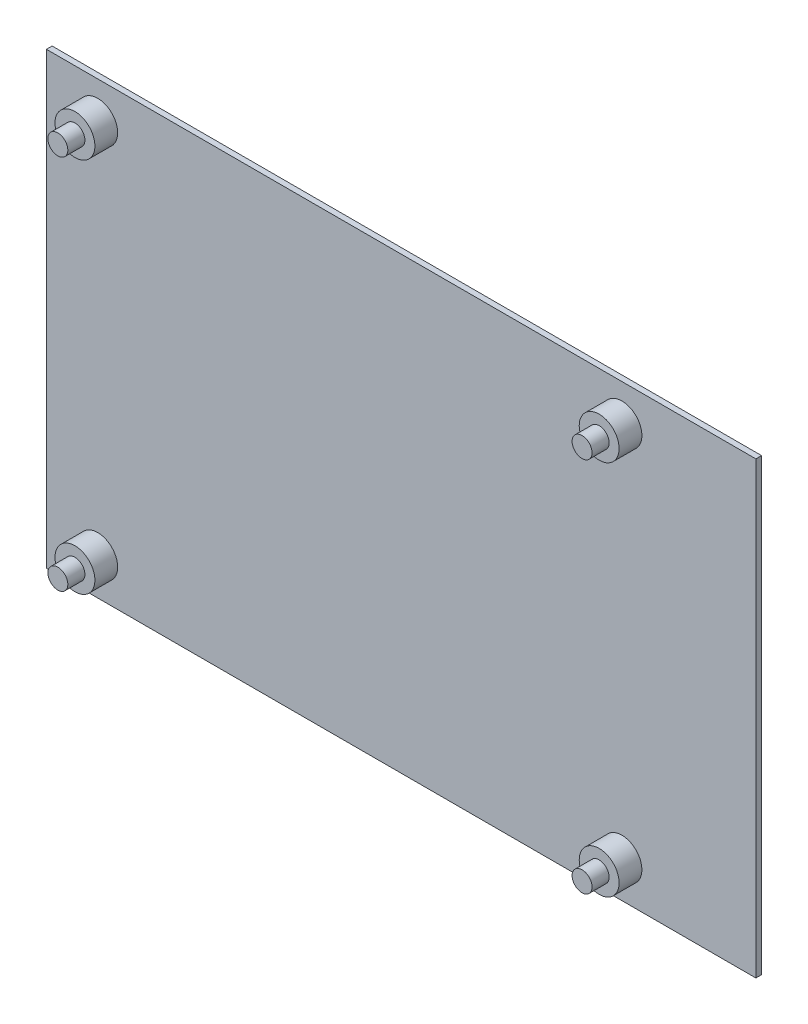
ISO-10303-21;
HEADER;
FILE_DESCRIPTION(('STEP AP214'),'2;1');
FILE_NAME('part.step','',(''),(''),'','','');
FILE_SCHEMA(('AUTOMOTIVE_DESIGN { 1 0 10303 214 1 1 1 1 }'));
ENDSEC;
DATA;
#1=APPLICATION_CONTEXT('core data for automotive mechanical design processes');
#2=APPLICATION_PROTOCOL_DEFINITION('international standard','automotive_design',2000,#1);
#3=PRODUCT_CONTEXT('',#1,'mechanical');
#4=PRODUCT('Part','Part','',(#3));
#5=PRODUCT_RELATED_PRODUCT_CATEGORY('part','',(#4));
#6=PRODUCT_DEFINITION_FORMATION('','',#4);
#7=PRODUCT_DEFINITION_CONTEXT('part definition',#1,'design');
#8=PRODUCT_DEFINITION('design','',#6,#7);
#9=PRODUCT_DEFINITION_SHAPE('','',#8);
#10=(LENGTH_UNIT() NAMED_UNIT(*) SI_UNIT(.MILLI.,.METRE.));
#11=(NAMED_UNIT(*) PLANE_ANGLE_UNIT() SI_UNIT($,.RADIAN.));
#12=(NAMED_UNIT(*) SI_UNIT($,.STERADIAN.) SOLID_ANGLE_UNIT());
#13=UNCERTAINTY_MEASURE_WITH_UNIT(LENGTH_MEASURE(1.E-05),#10,'distance_accuracy_value','');
#14=(GEOMETRIC_REPRESENTATION_CONTEXT(3) GLOBAL_UNCERTAINTY_ASSIGNED_CONTEXT((#13)) GLOBAL_UNIT_ASSIGNED_CONTEXT((#10,
#11,#12)) REPRESENTATION_CONTEXT('',''));
#15=CARTESIAN_POINT('',(0.,0.,0.));
#16=DIRECTION('',(0.,0.,1.));
#17=DIRECTION('',(1.,0.,0.));
#18=AXIS2_PLACEMENT_3D('',#15,#16,#17);
#19=CARTESIAN_POINT('',(-77.2499999999999,34.2,1.));
#20=DIRECTION('',(1.,0.,0.));
#21=DIRECTION('',(0.,0.,-1.));
#22=AXIS2_PLACEMENT_3D('',#19,#20,#21);
#23=PLANE('',#22);
#24=DIRECTION('',(0.,-1.,0.));
#25=VECTOR('',#24,1.);
#26=CARTESIAN_POINT('',(-77.2499999999999,34.2,0.));
#27=LINE('',#26,#25);
#28=CARTESIAN_POINT('',(-77.2499999999999,34.2,0.));
#29=VERTEX_POINT('',#28);
#30=CARTESIAN_POINT('',(-77.2499999999999,-44.7,0.));
#31=VERTEX_POINT('',#30);
#32=EDGE_CURVE('E99',#29,#31,#27,.T.);
#33=ORIENTED_EDGE('',*,*,#32,.T.);
#34=DIRECTION('',(0.,0.,-1.));
#35=VECTOR('',#34,1.);
#36=CARTESIAN_POINT('',(-77.2499999999999,-44.7,1.));
#37=LINE('',#36,#35);
#38=CARTESIAN_POINT('',(-77.2499999999999,-44.7,1.));
#39=VERTEX_POINT('',#38);
#40=EDGE_CURVE('E90',#39,#31,#37,.T.);
#41=ORIENTED_EDGE('',*,*,#40,.F.);
#42=DIRECTION('',(0.,-1.,0.));
#43=VECTOR('',#42,1.);
#44=CARTESIAN_POINT('',(-77.2499999999999,34.2,1.));
#45=LINE('',#44,#43);
#46=CARTESIAN_POINT('',(-77.2499999999999,34.2,1.));
#47=VERTEX_POINT('',#46);
#48=EDGE_CURVE('E84',#47,#39,#45,.T.);
#49=ORIENTED_EDGE('',*,*,#48,.F.);
#50=DIRECTION('',(0.,0.,-1.));
#51=VECTOR('',#50,1.);
#52=CARTESIAN_POINT('',(-77.2499999999999,34.2,1.));
#53=LINE('',#52,#51);
#54=EDGE_CURVE('E95',#47,#29,#53,.T.);
#55=ORIENTED_EDGE('',*,*,#54,.T.);
#56=EDGE_LOOP('',(#33,#41,#49,#55));
#57=FACE_BOUND('',#56,.T.);
#58=ADVANCED_FACE('F32',(#57),#23,.F.);
#59=CARTESIAN_POINT('',(47.25,-44.7,1.));
#60=DIRECTION('',(0.,1.,0.));
#61=DIRECTION('',(0.,0.,1.));
#62=AXIS2_PLACEMENT_3D('',#59,#60,#61);
#63=PLANE('',#62);
#64=DIRECTION('',(1.,0.,0.));
#65=VECTOR('',#64,1.);
#66=CARTESIAN_POINT('',(47.25,-44.7,0.));
#67=LINE('',#66,#65);
#68=CARTESIAN_POINT('',(47.25,-44.7,0.));
#69=VERTEX_POINT('',#68);
#70=EDGE_CURVE('E89',#31,#69,#67,.T.);
#71=ORIENTED_EDGE('',*,*,#70,.T.);
#72=DIRECTION('',(0.,0.,-1.));
#73=VECTOR('',#72,1.);
#74=CARTESIAN_POINT('',(47.25,-44.7,1.));
#75=LINE('',#74,#73);
#76=CARTESIAN_POINT('',(47.25,-44.7,1.));
#77=VERTEX_POINT('',#76);
#78=EDGE_CURVE('E87',#77,#69,#75,.T.);
#79=ORIENTED_EDGE('',*,*,#78,.F.);
#80=DIRECTION('',(1.,0.,0.));
#81=VECTOR('',#80,1.);
#82=CARTESIAN_POINT('',(47.25,-44.7,1.));
#83=LINE('',#82,#81);
#84=EDGE_CURVE('E79',#39,#77,#83,.T.);
#85=ORIENTED_EDGE('',*,*,#84,.F.);
#86=ORIENTED_EDGE('',*,*,#40,.T.);
#87=EDGE_LOOP('',(#71,#79,#85,#86));
#88=FACE_BOUND('',#87,.T.);
#89=ADVANCED_FACE('F88',(#88),#63,.F.);
#90=CARTESIAN_POINT('',(47.25,34.2,1.));
#91=DIRECTION('',(-1.,0.,0.));
#92=DIRECTION('',(0.,-1.,0.));
#93=AXIS2_PLACEMENT_3D('',#90,#91,#92);
#94=PLANE('',#93);
#95=DIRECTION('',(0.,1.,0.));
#96=VECTOR('',#95,1.);
#97=CARTESIAN_POINT('',(47.25,34.2,0.));
#98=LINE('',#97,#96);
#99=CARTESIAN_POINT('',(47.25,34.2,0.));
#100=VERTEX_POINT('',#99);
#101=EDGE_CURVE('E65',#69,#100,#98,.T.);
#102=ORIENTED_EDGE('',*,*,#101,.T.);
#103=DIRECTION('',(0.,0.,-1.));
#104=VECTOR('',#103,1.);
#105=CARTESIAN_POINT('',(47.25,34.2,1.));
#106=LINE('',#105,#104);
#107=CARTESIAN_POINT('',(47.25,34.2,1.));
#108=VERTEX_POINT('',#107);
#109=EDGE_CURVE('E91',#108,#100,#106,.T.);
#110=ORIENTED_EDGE('',*,*,#109,.F.);
#111=DIRECTION('',(0.,1.,0.));
#112=VECTOR('',#111,1.);
#113=CARTESIAN_POINT('',(47.25,34.2,1.));
#114=LINE('',#113,#112);
#115=EDGE_CURVE('E82',#77,#108,#114,.T.);
#116=ORIENTED_EDGE('',*,*,#115,.F.);
#117=ORIENTED_EDGE('',*,*,#78,.T.);
#118=EDGE_LOOP('',(#102,#110,#116,#117));
#119=FACE_BOUND('',#118,.T.);
#120=ADVANCED_FACE('F93',(#119),#94,.F.);
#121=CARTESIAN_POINT('',(47.25,34.2,1.));
#122=DIRECTION('',(0.,-1.,0.));
#123=DIRECTION('',(1.,0.,0.));
#124=AXIS2_PLACEMENT_3D('',#121,#122,#123);
#125=PLANE('',#124);
#126=DIRECTION('',(-1.,0.,0.));
#127=VECTOR('',#126,1.);
#128=CARTESIAN_POINT('',(47.25,34.2,0.));
#129=LINE('',#128,#127);
#130=EDGE_CURVE('E71',#100,#29,#129,.T.);
#131=ORIENTED_EDGE('',*,*,#130,.T.);
#132=ORIENTED_EDGE('',*,*,#54,.F.);
#133=DIRECTION('',(-1.,0.,0.));
#134=VECTOR('',#133,1.);
#135=CARTESIAN_POINT('',(47.25,34.2,1.));
#136=LINE('',#135,#134);
#137=EDGE_CURVE('E48',#108,#47,#136,.T.);
#138=ORIENTED_EDGE('',*,*,#137,.F.);
#139=ORIENTED_EDGE('',*,*,#109,.T.);
#140=EDGE_LOOP('',(#131,#132,#138,#139));
#141=FACE_BOUND('',#140,.T.);
#142=ADVANCED_FACE('F122',(#141),#125,.F.);
#143=CARTESIAN_POINT('',(0.,0.,1.));
#144=DIRECTION('',(0.,0.,-1.));
#145=DIRECTION('',(-1.,0.,0.));
#146=AXIS2_PLACEMENT_3D('',#143,#144,#145);
#147=PLANE('',#146);
#148=CARTESIAN_POINT('',(-68.2499999999999,-38.25,1.));
#149=DIRECTION('',(0.,0.,-1.));
#150=DIRECTION('',(-1.,0.,0.));
#151=AXIS2_PLACEMENT_3D('',#148,#149,#150);
#152=CIRCLE('',#151,3.50000000000001);
#153=CARTESIAN_POINT('',(-71.75,-38.25,1.));
#154=VERTEX_POINT('',#153);
#155=EDGE_CURVE('E11',#154,#154,#152,.F.);
#156=ORIENTED_EDGE('',*,*,#155,.F.);
#157=EDGE_LOOP('',(#156));
#158=FACE_BOUND('',#157,.T.);
#159=CARTESIAN_POINT('',(23.7500000000001,-38.25,1.));
#160=DIRECTION('',(0.,0.,-1.));
#161=DIRECTION('',(-1.,0.,0.));
#162=AXIS2_PLACEMENT_3D('',#159,#160,#161);
#163=CIRCLE('',#162,3.5);
#164=CARTESIAN_POINT('',(20.2500000000001,-38.25,1.));
#165=VERTEX_POINT('',#164);
#166=EDGE_CURVE('E40',#165,#165,#163,.F.);
#167=ORIENTED_EDGE('',*,*,#166,.F.);
#168=EDGE_LOOP('',(#167));
#169=FACE_BOUND('',#168,.T.);
#170=CARTESIAN_POINT('',(23.75,27.75,1.));
#171=DIRECTION('',(0.,0.,-1.));
#172=DIRECTION('',(-1.,0.,0.));
#173=AXIS2_PLACEMENT_3D('',#170,#171,#172);
#174=CIRCLE('',#173,3.5);
#175=CARTESIAN_POINT('',(20.25,27.75,1.));
#176=VERTEX_POINT('',#175);
#177=EDGE_CURVE('E112',#176,#176,#174,.F.);
#178=ORIENTED_EDGE('',*,*,#177,.F.);
#179=EDGE_LOOP('',(#178));
#180=FACE_BOUND('',#179,.T.);
#181=CARTESIAN_POINT('',(-68.2499999999999,27.75,1.));
#182=DIRECTION('',(0.,0.,-1.));
#183=DIRECTION('',(-1.,0.,0.));
#184=AXIS2_PLACEMENT_3D('',#181,#182,#183);
#185=CIRCLE('',#184,3.50000000000001);
#186=CARTESIAN_POINT('',(-71.75,27.75,1.));
#187=VERTEX_POINT('',#186);
#188=EDGE_CURVE('E109',#187,#187,#185,.F.);
#189=ORIENTED_EDGE('',*,*,#188,.F.);
#190=EDGE_LOOP('',(#189));
#191=FACE_BOUND('',#190,.T.);
#192=ORIENTED_EDGE('',*,*,#48,.T.);
#193=ORIENTED_EDGE('',*,*,#84,.T.);
#194=ORIENTED_EDGE('',*,*,#115,.T.);
#195=ORIENTED_EDGE('',*,*,#137,.T.);
#196=EDGE_LOOP('',(#192,#193,#194,#195));
#197=FACE_BOUND('',#196,.T.);
#198=ADVANCED_FACE('F80',(#158,#169,#180,#191,#197),#147,.F.);
#199=CARTESIAN_POINT('',(0.,0.,0.));
#200=DIRECTION('',(0.,0.,-1.));
#201=DIRECTION('',(-1.,0.,0.));
#202=AXIS2_PLACEMENT_3D('',#199,#200,#201);
#203=PLANE('',#202);
#204=ORIENTED_EDGE('',*,*,#32,.F.);
#205=ORIENTED_EDGE('',*,*,#130,.F.);
#206=ORIENTED_EDGE('',*,*,#101,.F.);
#207=ORIENTED_EDGE('',*,*,#70,.F.);
#208=EDGE_LOOP('',(#204,#205,#206,#207));
#209=FACE_BOUND('',#208,.T.);
#210=ADVANCED_FACE('F121',(#209),#203,.T.);
#211=CARTESIAN_POINT('',(-68.2499999999999,27.75,5.));
#212=DIRECTION('',(0.,0.,-1.));
#213=DIRECTION('',(-1.,0.,0.));
#214=AXIS2_PLACEMENT_3D('',#211,#212,#213);
#215=CYLINDRICAL_SURFACE('',#214,3.50000000000001);
#216=CARTESIAN_POINT('',(-68.2499999999999,27.75,5.));
#217=DIRECTION('',(0.,0.,1.));
#218=DIRECTION('',(1.,0.,0.));
#219=AXIS2_PLACEMENT_3D('',#216,#217,#218);
#220=CIRCLE('',#219,3.50000000000001);
#221=CARTESIAN_POINT('',(-64.7499999999999,27.75,5.));
#222=VERTEX_POINT('',#221);
#223=EDGE_CURVE('E102',#222,#222,#220,.T.);
#224=ORIENTED_EDGE('',*,*,#223,.F.);
#225=EDGE_LOOP('',(#224));
#226=FACE_BOUND('',#225,.T.);
#227=ORIENTED_EDGE('',*,*,#188,.T.);
#228=EDGE_LOOP('',(#227));
#229=FACE_BOUND('',#228,.T.);
#230=ADVANCED_FACE('F129',(#226,#229),#215,.T.);
#231=CARTESIAN_POINT('',(-68.2499999999999,27.75,5.));
#232=DIRECTION('',(0.,0.,1.));
#233=DIRECTION('',(1.,0.,0.));
#234=AXIS2_PLACEMENT_3D('',#231,#232,#233);
#235=PLANE('',#234);
#236=CARTESIAN_POINT('',(-68.2499999999999,27.75,5.));
#237=DIRECTION('',(0.,0.,1.));
#238=DIRECTION('',(1.,0.,0.));
#239=AXIS2_PLACEMENT_3D('',#236,#237,#238);
#240=CIRCLE('',#239,1.75);
#241=CARTESIAN_POINT('',(-66.4999999999999,27.75,5.));
#242=VERTEX_POINT('',#241);
#243=EDGE_CURVE('E352',#242,#242,#240,.T.);
#244=ORIENTED_EDGE('',*,*,#243,.F.);
#245=EDGE_LOOP('',(#244));
#246=FACE_BOUND('',#245,.T.);
#247=ORIENTED_EDGE('',*,*,#223,.T.);
#248=EDGE_LOOP('',(#247));
#249=FACE_BOUND('',#248,.T.);
#250=ADVANCED_FACE('F131',(#246,#249),#235,.T.);
#251=CARTESIAN_POINT('',(23.75,27.75,5.));
#252=DIRECTION('',(0.,0.,-1.));
#253=DIRECTION('',(-1.,0.,0.));
#254=AXIS2_PLACEMENT_3D('',#251,#252,#253);
#255=CYLINDRICAL_SURFACE('',#254,3.5);
#256=CARTESIAN_POINT('',(23.75,27.75,5.));
#257=DIRECTION('',(0.,0.,1.));
#258=DIRECTION('',(1.,0.,0.));
#259=AXIS2_PLACEMENT_3D('',#256,#257,#258);
#260=CIRCLE('',#259,3.5);
#261=CARTESIAN_POINT('',(27.25,27.75,5.));
#262=VERTEX_POINT('',#261);
#263=EDGE_CURVE('E366',#262,#262,#260,.T.);
#264=ORIENTED_EDGE('',*,*,#263,.F.);
#265=EDGE_LOOP('',(#264));
#266=FACE_BOUND('',#265,.T.);
#267=ORIENTED_EDGE('',*,*,#177,.T.);
#268=EDGE_LOOP('',(#267));
#269=FACE_BOUND('',#268,.T.);
#270=ADVANCED_FACE('F138',(#266,#269),#255,.T.);
#271=CARTESIAN_POINT('',(23.75,27.75,5.));
#272=DIRECTION('',(0.,0.,1.));
#273=DIRECTION('',(1.,0.,0.));
#274=AXIS2_PLACEMENT_3D('',#271,#272,#273);
#275=PLANE('',#274);
#276=CARTESIAN_POINT('',(23.75,27.75,5.));
#277=DIRECTION('',(0.,0.,1.));
#278=DIRECTION('',(1.,0.,0.));
#279=AXIS2_PLACEMENT_3D('',#276,#277,#278);
#280=CIRCLE('',#279,1.75);
#281=CARTESIAN_POINT('',(25.5,27.75,5.));
#282=VERTEX_POINT('',#281);
#283=EDGE_CURVE('E347',#282,#282,#280,.T.);
#284=ORIENTED_EDGE('',*,*,#283,.F.);
#285=EDGE_LOOP('',(#284));
#286=FACE_BOUND('',#285,.T.);
#287=ORIENTED_EDGE('',*,*,#263,.T.);
#288=EDGE_LOOP('',(#287));
#289=FACE_BOUND('',#288,.T.);
#290=ADVANCED_FACE('F203',(#286,#289),#275,.T.);
#291=CARTESIAN_POINT('',(23.7500000000001,-38.25,5.));
#292=DIRECTION('',(0.,0.,-1.));
#293=DIRECTION('',(-1.,0.,0.));
#294=AXIS2_PLACEMENT_3D('',#291,#292,#293);
#295=CYLINDRICAL_SURFACE('',#294,3.5);
#296=CARTESIAN_POINT('',(23.7500000000001,-38.25,5.));
#297=DIRECTION('',(0.,0.,1.));
#298=DIRECTION('',(1.,0.,0.));
#299=AXIS2_PLACEMENT_3D('',#296,#297,#298);
#300=CIRCLE('',#299,3.5);
#301=CARTESIAN_POINT('',(27.2500000000001,-38.25,5.));
#302=VERTEX_POINT('',#301);
#303=EDGE_CURVE('E363',#302,#302,#300,.T.);
#304=ORIENTED_EDGE('',*,*,#303,.F.);
#305=EDGE_LOOP('',(#304));
#306=FACE_BOUND('',#305,.T.);
#307=ORIENTED_EDGE('',*,*,#166,.T.);
#308=EDGE_LOOP('',(#307));
#309=FACE_BOUND('',#308,.T.);
#310=ADVANCED_FACE('F117',(#306,#309),#295,.T.);
#311=CARTESIAN_POINT('',(23.7500000000001,-38.25,5.));
#312=DIRECTION('',(0.,0.,1.));
#313=DIRECTION('',(1.,0.,0.));
#314=AXIS2_PLACEMENT_3D('',#311,#312,#313);
#315=PLANE('',#314);
#316=CARTESIAN_POINT('',(23.7500000000001,-38.25,5.));
#317=DIRECTION('',(0.,0.,1.));
#318=DIRECTION('',(1.,0.,0.));
#319=AXIS2_PLACEMENT_3D('',#316,#317,#318);
#320=CIRCLE('',#319,1.75);
#321=CARTESIAN_POINT('',(25.5000000000001,-38.25,5.));
#322=VERTEX_POINT('',#321);
#323=EDGE_CURVE('E337',#322,#322,#320,.T.);
#324=ORIENTED_EDGE('',*,*,#323,.F.);
#325=EDGE_LOOP('',(#324));
#326=FACE_BOUND('',#325,.T.);
#327=ORIENTED_EDGE('',*,*,#303,.T.);
#328=EDGE_LOOP('',(#327));
#329=FACE_BOUND('',#328,.T.);
#330=ADVANCED_FACE('F220',(#326,#329),#315,.T.);
#331=CARTESIAN_POINT('',(-68.2499999999999,-38.25,5.));
#332=DIRECTION('',(0.,0.,-1.));
#333=DIRECTION('',(-1.,0.,0.));
#334=AXIS2_PLACEMENT_3D('',#331,#332,#333);
#335=CYLINDRICAL_SURFACE('',#334,3.50000000000001);
#336=CARTESIAN_POINT('',(-68.2499999999999,-38.25,5.));
#337=DIRECTION('',(0.,0.,1.));
#338=DIRECTION('',(1.,0.,0.));
#339=AXIS2_PLACEMENT_3D('',#336,#337,#338);
#340=CIRCLE('',#339,3.50000000000001);
#341=CARTESIAN_POINT('',(-64.7499999999999,-38.25,5.));
#342=VERTEX_POINT('',#341);
#343=EDGE_CURVE('E358',#342,#342,#340,.T.);
#344=ORIENTED_EDGE('',*,*,#343,.F.);
#345=EDGE_LOOP('',(#344));
#346=FACE_BOUND('',#345,.T.);
#347=ORIENTED_EDGE('',*,*,#155,.T.);
#348=EDGE_LOOP('',(#347));
#349=FACE_BOUND('',#348,.T.);
#350=ADVANCED_FACE('F228',(#346,#349),#335,.T.);
#351=CARTESIAN_POINT('',(-68.2499999999999,-38.25,5.));
#352=DIRECTION('',(0.,0.,1.));
#353=DIRECTION('',(1.,0.,0.));
#354=AXIS2_PLACEMENT_3D('',#351,#352,#353);
#355=PLANE('',#354);
#356=CARTESIAN_POINT('',(-68.2499999999999,-38.25,5.));
#357=DIRECTION('',(0.,0.,1.));
#358=DIRECTION('',(1.,0.,0.));
#359=AXIS2_PLACEMENT_3D('',#356,#357,#358);
#360=CIRCLE('',#359,1.75);
#361=CARTESIAN_POINT('',(-66.4999999999999,-38.25,5.));
#362=VERTEX_POINT('',#361);
#363=EDGE_CURVE('E338',#362,#362,#360,.T.);
#364=ORIENTED_EDGE('',*,*,#363,.F.);
#365=EDGE_LOOP('',(#364));
#366=FACE_BOUND('',#365,.T.);
#367=ORIENTED_EDGE('',*,*,#343,.T.);
#368=EDGE_LOOP('',(#367));
#369=FACE_BOUND('',#368,.T.);
#370=ADVANCED_FACE('F237',(#366,#369),#355,.T.);
#371=CARTESIAN_POINT('',(-68.2499999999999,27.75,8.));
#372=DIRECTION('',(0.,0.,-1.));
#373=DIRECTION('',(-1.,0.,0.));
#374=AXIS2_PLACEMENT_3D('',#371,#372,#373);
#375=CYLINDRICAL_SURFACE('',#374,1.75);
#376=CARTESIAN_POINT('',(-68.2499999999999,27.75,8.));
#377=DIRECTION('',(0.,0.,1.));
#378=DIRECTION('',(1.,0.,0.));
#379=AXIS2_PLACEMENT_3D('',#376,#377,#378);
#380=CIRCLE('',#379,1.75);
#381=CARTESIAN_POINT('',(-66.4999999999999,27.75,8.));
#382=VERTEX_POINT('',#381);
#383=EDGE_CURVE('E355',#382,#382,#380,.T.);
#384=ORIENTED_EDGE('',*,*,#383,.F.);
#385=EDGE_LOOP('',(#384));
#386=FACE_BOUND('',#385,.T.);
#387=ORIENTED_EDGE('',*,*,#243,.T.);
#388=EDGE_LOOP('',(#387));
#389=FACE_BOUND('',#388,.T.);
#390=ADVANCED_FACE('F245',(#386,#389),#375,.T.);
#391=CARTESIAN_POINT('',(-68.2499999999999,27.75,8.));
#392=DIRECTION('',(0.,0.,1.));
#393=DIRECTION('',(1.,0.,0.));
#394=AXIS2_PLACEMENT_3D('',#391,#392,#393);
#395=PLANE('',#394);
#396=ORIENTED_EDGE('',*,*,#383,.T.);
#397=EDGE_LOOP('',(#396));
#398=FACE_BOUND('',#397,.T.);
#399=ADVANCED_FACE('F254',(#398),#395,.T.);
#400=CARTESIAN_POINT('',(23.75,27.75,8.));
#401=DIRECTION('',(0.,0.,-1.));
#402=DIRECTION('',(-1.,0.,0.));
#403=AXIS2_PLACEMENT_3D('',#400,#401,#402);
#404=CYLINDRICAL_SURFACE('',#403,1.75);
#405=CARTESIAN_POINT('',(23.75,27.75,8.));
#406=DIRECTION('',(0.,0.,1.));
#407=DIRECTION('',(1.,0.,0.));
#408=AXIS2_PLACEMENT_3D('',#405,#406,#407);
#409=CIRCLE('',#408,1.75);
#410=CARTESIAN_POINT('',(25.5,27.75,8.));
#411=VERTEX_POINT('',#410);
#412=EDGE_CURVE('E349',#411,#411,#409,.T.);
#413=ORIENTED_EDGE('',*,*,#412,.F.);
#414=EDGE_LOOP('',(#413));
#415=FACE_BOUND('',#414,.T.);
#416=ORIENTED_EDGE('',*,*,#283,.T.);
#417=EDGE_LOOP('',(#416));
#418=FACE_BOUND('',#417,.T.);
#419=ADVANCED_FACE('F263',(#415,#418),#404,.T.);
#420=CARTESIAN_POINT('',(23.75,27.75,8.));
#421=DIRECTION('',(0.,0.,1.));
#422=DIRECTION('',(1.,0.,0.));
#423=AXIS2_PLACEMENT_3D('',#420,#421,#422);
#424=PLANE('',#423);
#425=ORIENTED_EDGE('',*,*,#412,.T.);
#426=EDGE_LOOP('',(#425));
#427=FACE_BOUND('',#426,.T.);
#428=ADVANCED_FACE('F272',(#427),#424,.T.);
#429=CARTESIAN_POINT('',(23.7500000000001,-38.25,8.));
#430=DIRECTION('',(0.,0.,-1.));
#431=DIRECTION('',(-1.,0.,0.));
#432=AXIS2_PLACEMENT_3D('',#429,#430,#431);
#433=CYLINDRICAL_SURFACE('',#432,1.75);
#434=CARTESIAN_POINT('',(23.7500000000001,-38.25,8.));
#435=DIRECTION('',(0.,0.,1.));
#436=DIRECTION('',(1.,0.,0.));
#437=AXIS2_PLACEMENT_3D('',#434,#435,#436);
#438=CIRCLE('',#437,1.75);
#439=CARTESIAN_POINT('',(25.5000000000001,-38.25,8.));
#440=VERTEX_POINT('',#439);
#441=EDGE_CURVE('E341',#440,#440,#438,.T.);
#442=ORIENTED_EDGE('',*,*,#441,.F.);
#443=EDGE_LOOP('',(#442));
#444=FACE_BOUND('',#443,.T.);
#445=ORIENTED_EDGE('',*,*,#323,.T.);
#446=EDGE_LOOP('',(#445));
#447=FACE_BOUND('',#446,.T.);
#448=ADVANCED_FACE('F281',(#444,#447),#433,.T.);
#449=CARTESIAN_POINT('',(23.7500000000001,-38.25,8.));
#450=DIRECTION('',(0.,0.,1.));
#451=DIRECTION('',(1.,0.,0.));
#452=AXIS2_PLACEMENT_3D('',#449,#450,#451);
#453=PLANE('',#452);
#454=ORIENTED_EDGE('',*,*,#441,.T.);
#455=EDGE_LOOP('',(#454));
#456=FACE_BOUND('',#455,.T.);
#457=ADVANCED_FACE('F290',(#456),#453,.T.);
#458=CARTESIAN_POINT('',(-68.2499999999999,-38.25,8.));
#459=DIRECTION('',(0.,0.,-1.));
#460=DIRECTION('',(-1.,0.,0.));
#461=AXIS2_PLACEMENT_3D('',#458,#459,#460);
#462=CYLINDRICAL_SURFACE('',#461,1.75);
#463=CARTESIAN_POINT('',(-68.2499999999999,-38.25,8.));
#464=DIRECTION('',(0.,0.,1.));
#465=DIRECTION('',(1.,0.,0.));
#466=AXIS2_PLACEMENT_3D('',#463,#464,#465);
#467=CIRCLE('',#466,1.75);
#468=CARTESIAN_POINT('',(-66.4999999999999,-38.25,8.));
#469=VERTEX_POINT('',#468);
#470=EDGE_CURVE('E336',#469,#469,#467,.T.);
#471=ORIENTED_EDGE('',*,*,#470,.F.);
#472=EDGE_LOOP('',(#471));
#473=FACE_BOUND('',#472,.T.);
#474=ORIENTED_EDGE('',*,*,#363,.T.);
#475=EDGE_LOOP('',(#474));
#476=FACE_BOUND('',#475,.T.);
#477=ADVANCED_FACE('F299',(#473,#476),#462,.T.);
#478=CARTESIAN_POINT('',(-68.2499999999999,-38.25,8.));
#479=DIRECTION('',(0.,0.,1.));
#480=DIRECTION('',(1.,0.,0.));
#481=AXIS2_PLACEMENT_3D('',#478,#479,#480);
#482=PLANE('',#481);
#483=ORIENTED_EDGE('',*,*,#470,.T.);
#484=EDGE_LOOP('',(#483));
#485=FACE_BOUND('',#484,.T.);
#486=ADVANCED_FACE('F308',(#485),#482,.T.);
#487=CLOSED_SHELL('',(#58,#89,#120,#142,#198,#210,#230,#250,#270,#290,#310,#330,#350,#370,#390,
#399,#419,#428,#448,#457,#477,#486));
#488=MANIFOLD_SOLID_BREP('B2',#487);
#489=ADVANCED_BREP_SHAPE_REPRESENTATION('',(#18,#488),#14);
#490=SHAPE_DEFINITION_REPRESENTATION(#9,#489);
ENDSEC;
END-ISO-10303-21;
